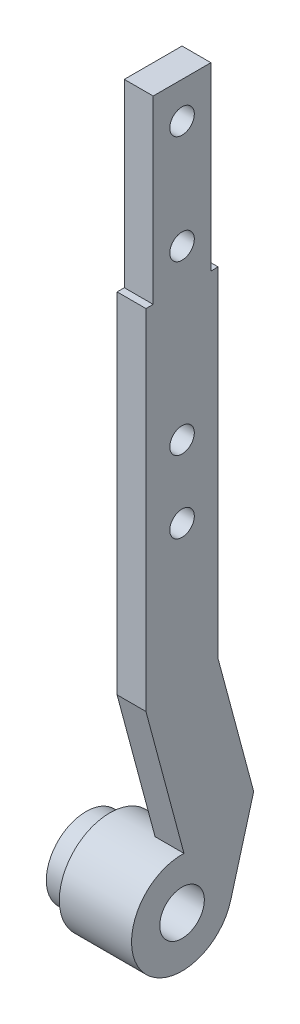
ISO-10303-21;
HEADER;
FILE_DESCRIPTION(('STEP AP214'),'2;1');
FILE_NAME('part.step','',(''),(''),'','','');
FILE_SCHEMA(('AUTOMOTIVE_DESIGN { 1 0 10303 214 1 1 1 1 }'));
ENDSEC;
DATA;
#1=APPLICATION_CONTEXT('core data for automotive mechanical design processes');
#2=APPLICATION_PROTOCOL_DEFINITION('international standard','automotive_design',2000,#1);
#3=PRODUCT_CONTEXT('',#1,'mechanical');
#4=PRODUCT('Part','Part','',(#3));
#5=PRODUCT_RELATED_PRODUCT_CATEGORY('part','',(#4));
#6=PRODUCT_DEFINITION_FORMATION('','',#4);
#7=PRODUCT_DEFINITION_CONTEXT('part definition',#1,'design');
#8=PRODUCT_DEFINITION('design','',#6,#7);
#9=PRODUCT_DEFINITION_SHAPE('','',#8);
#10=(LENGTH_UNIT() NAMED_UNIT(*) SI_UNIT(.MILLI.,.METRE.));
#11=(NAMED_UNIT(*) PLANE_ANGLE_UNIT() SI_UNIT($,.RADIAN.));
#12=(NAMED_UNIT(*) SI_UNIT($,.STERADIAN.) SOLID_ANGLE_UNIT());
#13=UNCERTAINTY_MEASURE_WITH_UNIT(LENGTH_MEASURE(1.E-05),#10,'distance_accuracy_value','');
#14=(GEOMETRIC_REPRESENTATION_CONTEXT(3) GLOBAL_UNCERTAINTY_ASSIGNED_CONTEXT((#13)) GLOBAL_UNIT_ASSIGNED_CONTEXT((#10,
#11,#12)) REPRESENTATION_CONTEXT('',''));
#15=CARTESIAN_POINT('',(0.,0.,0.));
#16=DIRECTION('',(0.,0.,1.));
#17=DIRECTION('',(1.,0.,0.));
#18=AXIS2_PLACEMENT_3D('',#15,#16,#17);
#19=CARTESIAN_POINT('',(-30.145,0.,0.));
#20=DIRECTION('',(1.,0.,0.));
#21=DIRECTION('',(0.,0.,-1.));
#22=AXIS2_PLACEMENT_3D('',#19,#20,#21);
#23=CYLINDRICAL_SURFACE('',#22,7.);
#24=CARTESIAN_POINT('',(-30.145,0.,0.));
#25=DIRECTION('',(-1.,0.,0.));
#26=DIRECTION('',(0.,0.,1.));
#27=AXIS2_PLACEMENT_3D('',#24,#25,#26);
#28=CIRCLE('',#27,7.);
#29=CARTESIAN_POINT('',(-30.145,0.,7.));
#30=VERTEX_POINT('',#29);
#31=EDGE_CURVE('E51',#30,#30,#28,.T.);
#32=ORIENTED_EDGE('',*,*,#31,.F.);
#33=EDGE_LOOP('',(#32));
#34=FACE_BOUND('',#33,.T.);
#35=DIRECTION('',(1.,0.,0.));
#36=VECTOR('',#35,1.);
#37=CARTESIAN_POINT('',(-24.145,6.99491771434268,-0.266694899791794));
#38=LINE('',#37,#36);
#39=CARTESIAN_POINT('',(-24.145,6.99491771434268,-0.266694899791794));
#40=VERTEX_POINT('',#39);
#41=CARTESIAN_POINT('',(-20.145,6.99491771434268,-0.266694899791793));
#42=VERTEX_POINT('',#41);
#43=EDGE_CURVE('E63',#40,#42,#38,.T.);
#44=ORIENTED_EDGE('',*,*,#43,.F.);
#45=CARTESIAN_POINT('',(-24.145,0.,0.));
#46=DIRECTION('',(-1.,0.,0.));
#47=DIRECTION('',(0.,0.,1.));
#48=AXIS2_PLACEMENT_3D('',#45,#46,#47);
#49=CIRCLE('',#48,7.);
#50=CARTESIAN_POINT('',(-24.145,-1.87292477240286,-6.74478708314204));
#51=VERTEX_POINT('',#50);
#52=EDGE_CURVE('E58',#40,#51,#49,.T.);
#53=ORIENTED_EDGE('',*,*,#52,.T.);
#54=DIRECTION('',(1.,0.,0.));
#55=VECTOR('',#54,1.);
#56=CARTESIAN_POINT('',(-24.145,-1.87292477240286,-6.74478708314204));
#57=LINE('',#56,#55);
#58=CARTESIAN_POINT('',(-20.145,-1.87292477240286,-6.74478708314204));
#59=VERTEX_POINT('',#58);
#60=EDGE_CURVE('E174',#51,#59,#57,.T.);
#61=ORIENTED_EDGE('',*,*,#60,.T.);
#62=CARTESIAN_POINT('',(-20.145,0.,0.));
#63=DIRECTION('',(-1.,0.,0.));
#64=DIRECTION('',(0.,0.,1.));
#65=AXIS2_PLACEMENT_3D('',#62,#63,#64);
#66=CIRCLE('',#65,7.);
#67=EDGE_CURVE('E233',#59,#42,#66,.T.);
#68=ORIENTED_EDGE('',*,*,#67,.T.);
#69=EDGE_LOOP('',(#44,#53,#61,#68));
#70=FACE_BOUND('',#69,.T.);
#71=ADVANCED_FACE('F43',(#34,#70),#23,.T.);
#72=CARTESIAN_POINT('',(-30.145,0.,0.));
#73=DIRECTION('',(1.,0.,0.));
#74=DIRECTION('',(0.,0.,-1.));
#75=AXIS2_PLACEMENT_3D('',#72,#73,#74);
#76=CYLINDRICAL_SURFACE('',#75,3.0845);
#77=CARTESIAN_POINT('',(-20.145,0.,0.));
#78=DIRECTION('',(-1.,0.,0.));
#79=DIRECTION('',(0.,0.,1.));
#80=AXIS2_PLACEMENT_3D('',#77,#78,#79);
#81=CIRCLE('',#80,3.0845);
#82=CARTESIAN_POINT('',(-20.145,0.,3.0845));
#83=VERTEX_POINT('',#82);
#84=EDGE_CURVE('E230',#83,#83,#81,.T.);
#85=ORIENTED_EDGE('',*,*,#84,.F.);
#86=EDGE_LOOP('',(#85));
#87=FACE_BOUND('',#86,.T.);
#88=CARTESIAN_POINT('',(-27.145,0.,0.));
#89=DIRECTION('',(-1.,0.,0.));
#90=DIRECTION('',(0.,0.,1.));
#91=AXIS2_PLACEMENT_3D('',#88,#89,#90);
#92=CIRCLE('',#91,3.0845);
#93=CARTESIAN_POINT('',(-27.145,0.,3.0845));
#94=VERTEX_POINT('',#93);
#95=EDGE_CURVE('E227',#94,#94,#92,.T.);
#96=ORIENTED_EDGE('',*,*,#95,.T.);
#97=EDGE_LOOP('',(#96));
#98=FACE_BOUND('',#97,.T.);
#99=ADVANCED_FACE('F45',(#87,#98),#76,.F.);
#100=CARTESIAN_POINT('',(-30.145,0.,0.));
#101=DIRECTION('',(-1.,0.,0.));
#102=DIRECTION('',(0.,0.,1.));
#103=AXIS2_PLACEMENT_3D('',#100,#101,#102);
#104=PLANE('',#103);
#105=CARTESIAN_POINT('',(-30.145,0.,0.));
#106=DIRECTION('',(-1.,0.,0.));
#107=DIRECTION('',(0.,0.,1.));
#108=AXIS2_PLACEMENT_3D('',#105,#106,#107);
#109=CIRCLE('',#108,5.49999999999996);
#110=CARTESIAN_POINT('',(-30.145,0.,5.49999999999996));
#111=VERTEX_POINT('',#110);
#112=EDGE_CURVE('E552',#111,#111,#109,.T.);
#113=ORIENTED_EDGE('',*,*,#112,.F.);
#114=EDGE_LOOP('',(#113));
#115=FACE_BOUND('',#114,.T.);
#116=ORIENTED_EDGE('',*,*,#31,.T.);
#117=EDGE_LOOP('',(#116));
#118=FACE_BOUND('',#117,.T.);
#119=ADVANCED_FACE('F293',(#115,#118),#104,.T.);
#120=CARTESIAN_POINT('',(-20.145,0.,0.));
#121=DIRECTION('',(-1.,0.,0.));
#122=DIRECTION('',(0.,0.,1.));
#123=AXIS2_PLACEMENT_3D('',#120,#121,#122);
#124=PLANE('',#123);
#125=CARTESIAN_POINT('',(-20.145,56.7479660865774,0.));
#126=DIRECTION('',(1.,0.,0.));
#127=DIRECTION('',(0.,0.,-1.));
#128=AXIS2_PLACEMENT_3D('',#125,#126,#127);
#129=CIRCLE('',#128,1.7);
#130=CARTESIAN_POINT('',(-20.145,56.7479660865774,-1.7));
#131=VERTEX_POINT('',#130);
#132=EDGE_CURVE('E548',#131,#131,#129,.T.);
#133=ORIENTED_EDGE('',*,*,#132,.F.);
#134=EDGE_LOOP('',(#133));
#135=FACE_BOUND('',#134,.T.);
#136=CARTESIAN_POINT('',(-20.145,46.7479660865774,0.));
#137=DIRECTION('',(1.,0.,0.));
#138=DIRECTION('',(0.,0.,-1.));
#139=AXIS2_PLACEMENT_3D('',#136,#137,#138);
#140=CIRCLE('',#139,1.7);
#141=CARTESIAN_POINT('',(-20.145,46.7479660865774,-1.7));
#142=VERTEX_POINT('',#141);
#143=EDGE_CURVE('E558',#142,#142,#140,.T.);
#144=ORIENTED_EDGE('',*,*,#143,.F.);
#145=EDGE_LOOP('',(#144));
#146=FACE_BOUND('',#145,.T.);
#147=ORIENTED_EDGE('',*,*,#84,.T.);
#148=EDGE_LOOP('',(#147));
#149=FACE_BOUND('',#148,.T.);
#150=ORIENTED_EDGE('',*,*,#67,.F.);
#151=DIRECTION('',(0.,-0.963541011877434,0.267560681771837));
#152=VECTOR('',#151,1.);
#153=CARTESIAN_POINT('',(-20.145,-1.87292477240286,-6.74478708314204));
#154=LINE('',#153,#152);
#155=CARTESIAN_POINT('',(-20.145,9.5831081653679,-9.92595316268247));
#156=VERTEX_POINT('',#155);
#157=EDGE_CURVE('E197',#156,#59,#154,.T.);
#158=ORIENTED_EDGE('',*,*,#157,.F.);
#159=DIRECTION('',(0.,-0.965925826289068,-0.258819045102521));
#160=VECTOR('',#159,1.);
#161=CARTESIAN_POINT('',(-20.145,3.12343481414323,-11.656817420512));
#162=LINE('',#161,#160);
#163=CARTESIAN_POINT('',(-20.145,27.9670156442034,-5.));
#164=VERTEX_POINT('',#163);
#165=EDGE_CURVE('E195',#164,#156,#162,.T.);
#166=ORIENTED_EDGE('',*,*,#165,.F.);
#167=DIRECTION('',(0.,-1.,0.));
#168=VECTOR('',#167,1.);
#169=CARTESIAN_POINT('',(-20.145,0.,-5.));
#170=LINE('',#169,#168);
#171=CARTESIAN_POINT('',(-20.145,75.,-5.));
#172=VERTEX_POINT('',#171);
#173=EDGE_CURVE('E192',#172,#164,#170,.T.);
#174=ORIENTED_EDGE('',*,*,#173,.F.);
#175=DIRECTION('',(0.,0.,1.));
#176=VECTOR('',#175,1.);
#177=CARTESIAN_POINT('',(-20.145,75.,0.));
#178=LINE('',#177,#176);
#179=CARTESIAN_POINT('',(-20.145,75.,-4.00000000000001));
#180=VERTEX_POINT('',#179);
#181=EDGE_CURVE('E189',#172,#180,#178,.T.);
#182=ORIENTED_EDGE('',*,*,#181,.T.);
#183=DIRECTION('',(0.,1.,0.));
#184=VECTOR('',#183,1.);
#185=CARTESIAN_POINT('',(-20.145,0.,-4.00000000000001));
#186=LINE('',#185,#184);
#187=CARTESIAN_POINT('',(-20.145,100.,-4.00000000000001));
#188=VERTEX_POINT('',#187);
#189=EDGE_CURVE('E186',#180,#188,#186,.T.);
#190=ORIENTED_EDGE('',*,*,#189,.T.);
#191=DIRECTION('',(0.,0.,-1.));
#192=VECTOR('',#191,1.);
#193=CARTESIAN_POINT('',(-20.145,100.,0.));
#194=LINE('',#193,#192);
#195=CARTESIAN_POINT('',(-20.145,100.,4.));
#196=VERTEX_POINT('',#195);
#197=EDGE_CURVE('E183',#196,#188,#194,.T.);
#198=ORIENTED_EDGE('',*,*,#197,.F.);
#199=DIRECTION('',(0.,1.,0.));
#200=VECTOR('',#199,1.);
#201=CARTESIAN_POINT('',(-20.145,0.,4.));
#202=LINE('',#201,#200);
#203=CARTESIAN_POINT('',(-20.145,75.,4.));
#204=VERTEX_POINT('',#203);
#205=EDGE_CURVE('E181',#204,#196,#202,.T.);
#206=ORIENTED_EDGE('',*,*,#205,.F.);
#207=DIRECTION('',(0.,0.,-1.));
#208=VECTOR('',#207,1.);
#209=CARTESIAN_POINT('',(-20.145,75.,0.));
#210=LINE('',#209,#208);
#211=CARTESIAN_POINT('',(-20.145,75.,4.99999999999999));
#212=VERTEX_POINT('',#211);
#213=EDGE_CURVE('E179',#212,#204,#210,.T.);
#214=ORIENTED_EDGE('',*,*,#213,.F.);
#215=DIRECTION('',(0.,1.,0.));
#216=VECTOR('',#215,1.);
#217=CARTESIAN_POINT('',(-20.145,0.,4.99999999999999));
#218=LINE('',#217,#216);
#219=CARTESIAN_POINT('',(-20.145,26.6504906683294,4.99999999999999));
#220=VERTEX_POINT('',#219);
#221=EDGE_CURVE('E176',#220,#212,#218,.T.);
#222=ORIENTED_EDGE('',*,*,#221,.F.);
#223=DIRECTION('',(0.,0.965925826289068,0.258819045102521));
#224=VECTOR('',#223,1.);
#225=CARTESIAN_POINT('',(-20.145,0.53524436311802,-1.99755915762129));
#226=LINE('',#225,#224);
#227=EDGE_CURVE('E137',#42,#220,#226,.T.);
#228=ORIENTED_EDGE('',*,*,#227,.F.);
#229=EDGE_LOOP('',(#150,#158,#166,#174,#182,#190,#198,#206,#214,#222,#228));
#230=FACE_BOUND('',#229,.T.);
#231=CARTESIAN_POINT('',(-20.145,80.,0.));
#232=DIRECTION('',(-1.,0.,0.));
#233=DIRECTION('',(0.,0.,1.));
#234=AXIS2_PLACEMENT_3D('',#231,#232,#233);
#235=CIRCLE('',#234,1.70000000000001);
#236=CARTESIAN_POINT('',(-20.145,80.,1.7));
#237=VERTEX_POINT('',#236);
#238=EDGE_CURVE('E200',#237,#237,#235,.T.);
#239=ORIENTED_EDGE('',*,*,#238,.T.);
#240=EDGE_LOOP('',(#239));
#241=FACE_BOUND('',#240,.T.);
#242=CARTESIAN_POINT('',(-20.145,95.,0.));
#243=DIRECTION('',(-1.,0.,0.));
#244=DIRECTION('',(0.,0.,1.));
#245=AXIS2_PLACEMENT_3D('',#242,#243,#244);
#246=CIRCLE('',#245,1.70000000000001);
#247=CARTESIAN_POINT('',(-20.145,95.,1.7));
#248=VERTEX_POINT('',#247);
#249=EDGE_CURVE('E203',#248,#248,#246,.T.);
#250=ORIENTED_EDGE('',*,*,#249,.T.);
#251=EDGE_LOOP('',(#250));
#252=FACE_BOUND('',#251,.T.);
#253=ADVANCED_FACE('F238',(#135,#146,#149,#230,#241,#252),#124,.F.);
#254=CARTESIAN_POINT('',(-27.145,0.,0.));
#255=DIRECTION('',(-1.,0.,0.));
#256=DIRECTION('',(0.,0.,1.));
#257=AXIS2_PLACEMENT_3D('',#254,#255,#256);
#258=PLANE('',#257);
#259=ORIENTED_EDGE('',*,*,#95,.F.);
#260=EDGE_LOOP('',(#259));
#261=FACE_BOUND('',#260,.T.);
#262=ADVANCED_FACE('F299',(#261),#258,.F.);
#263=CARTESIAN_POINT('',(-24.145,0.53524436311802,-1.99755915762129));
#264=DIRECTION('',(0.,0.258819045102521,-0.965925826289068));
#265=DIRECTION('',(0.,0.965925826289068,0.258819045102521));
#266=AXIS2_PLACEMENT_3D('',#263,#264,#265);
#267=PLANE('',#266);
#268=ORIENTED_EDGE('',*,*,#227,.T.);
#269=DIRECTION('',(1.,0.,0.));
#270=VECTOR('',#269,1.);
#271=CARTESIAN_POINT('',(-24.145,26.6504906683294,4.99999999999999));
#272=LINE('',#271,#270);
#273=CARTESIAN_POINT('',(-24.145,26.6504906683294,4.99999999999999));
#274=VERTEX_POINT('',#273);
#275=EDGE_CURVE('E134',#274,#220,#272,.T.);
#276=ORIENTED_EDGE('',*,*,#275,.F.);
#277=DIRECTION('',(0.,0.965925826289068,0.258819045102521));
#278=VECTOR('',#277,1.);
#279=CARTESIAN_POINT('',(-24.145,0.53524436311802,-1.99755915762129));
#280=LINE('',#279,#278);
#281=EDGE_CURVE('E124',#40,#274,#280,.T.);
#282=ORIENTED_EDGE('',*,*,#281,.F.);
#283=ORIENTED_EDGE('',*,*,#43,.T.);
#284=EDGE_LOOP('',(#268,#276,#282,#283));
#285=FACE_BOUND('',#284,.T.);
#286=ADVANCED_FACE('F135',(#285),#267,.F.);
#287=CARTESIAN_POINT('',(-24.145,0.,4.99999999999999));
#288=DIRECTION('',(0.,0.,-1.));
#289=DIRECTION('',(-1.,0.,0.));
#290=AXIS2_PLACEMENT_3D('',#287,#288,#289);
#291=PLANE('',#290);
#292=ORIENTED_EDGE('',*,*,#221,.T.);
#293=DIRECTION('',(1.,0.,0.));
#294=VECTOR('',#293,1.);
#295=CARTESIAN_POINT('',(-24.145,75.,4.99999999999999));
#296=LINE('',#295,#294);
#297=CARTESIAN_POINT('',(-24.145,75.,4.99999999999999));
#298=VERTEX_POINT('',#297);
#299=EDGE_CURVE('E140',#298,#212,#296,.T.);
#300=ORIENTED_EDGE('',*,*,#299,.F.);
#301=DIRECTION('',(0.,1.,0.));
#302=VECTOR('',#301,1.);
#303=CARTESIAN_POINT('',(-24.145,0.,4.99999999999999));
#304=LINE('',#303,#302);
#305=EDGE_CURVE('E129',#274,#298,#304,.T.);
#306=ORIENTED_EDGE('',*,*,#305,.F.);
#307=ORIENTED_EDGE('',*,*,#275,.T.);
#308=EDGE_LOOP('',(#292,#300,#306,#307));
#309=FACE_BOUND('',#308,.T.);
#310=ADVANCED_FACE('F142',(#309),#291,.F.);
#311=CARTESIAN_POINT('',(-24.145,75.,0.));
#312=DIRECTION('',(0.,-1.,0.));
#313=DIRECTION('',(1.,0.,0.));
#314=AXIS2_PLACEMENT_3D('',#311,#312,#313);
#315=PLANE('',#314);
#316=ORIENTED_EDGE('',*,*,#213,.T.);
#317=DIRECTION('',(1.,0.,0.));
#318=VECTOR('',#317,1.);
#319=CARTESIAN_POINT('',(-24.145,75.,4.));
#320=LINE('',#319,#318);
#321=CARTESIAN_POINT('',(-24.145,75.,4.));
#322=VERTEX_POINT('',#321);
#323=EDGE_CURVE('E222',#322,#204,#320,.T.);
#324=ORIENTED_EDGE('',*,*,#323,.F.);
#325=DIRECTION('',(0.,0.,-1.));
#326=VECTOR('',#325,1.);
#327=CARTESIAN_POINT('',(-24.145,75.,0.));
#328=LINE('',#327,#326);
#329=EDGE_CURVE('E146',#298,#322,#328,.T.);
#330=ORIENTED_EDGE('',*,*,#329,.F.);
#331=ORIENTED_EDGE('',*,*,#299,.T.);
#332=EDGE_LOOP('',(#316,#324,#330,#331));
#333=FACE_BOUND('',#332,.T.);
#334=ADVANCED_FACE('F243',(#333),#315,.F.);
#335=CARTESIAN_POINT('',(-24.145,0.,4.));
#336=DIRECTION('',(0.,0.,-1.));
#337=DIRECTION('',(-1.,0.,0.));
#338=AXIS2_PLACEMENT_3D('',#335,#336,#337);
#339=PLANE('',#338);
#340=ORIENTED_EDGE('',*,*,#205,.T.);
#341=DIRECTION('',(1.,0.,0.));
#342=VECTOR('',#341,1.);
#343=CARTESIAN_POINT('',(-24.145,100.,4.));
#344=LINE('',#343,#342);
#345=CARTESIAN_POINT('',(-24.145,100.,4.));
#346=VERTEX_POINT('',#345);
#347=EDGE_CURVE('E219',#346,#196,#344,.T.);
#348=ORIENTED_EDGE('',*,*,#347,.F.);
#349=DIRECTION('',(0.,1.,0.));
#350=VECTOR('',#349,1.);
#351=CARTESIAN_POINT('',(-24.145,0.,4.));
#352=LINE('',#351,#350);
#353=EDGE_CURVE('E149',#322,#346,#352,.T.);
#354=ORIENTED_EDGE('',*,*,#353,.F.);
#355=ORIENTED_EDGE('',*,*,#323,.T.);
#356=EDGE_LOOP('',(#340,#348,#354,#355));
#357=FACE_BOUND('',#356,.T.);
#358=ADVANCED_FACE('F251',(#357),#339,.F.);
#359=CARTESIAN_POINT('',(-24.145,100.,0.));
#360=DIRECTION('',(0.,-1.,0.));
#361=DIRECTION('',(1.,0.,0.));
#362=AXIS2_PLACEMENT_3D('',#359,#360,#361);
#363=PLANE('',#362);
#364=ORIENTED_EDGE('',*,*,#197,.T.);
#365=DIRECTION('',(1.,0.,0.));
#366=VECTOR('',#365,1.);
#367=CARTESIAN_POINT('',(-24.145,100.,-4.00000000000001));
#368=LINE('',#367,#366);
#369=CARTESIAN_POINT('',(-24.145,100.,-4.00000000000001));
#370=VERTEX_POINT('',#369);
#371=EDGE_CURVE('E217',#370,#188,#368,.T.);
#372=ORIENTED_EDGE('',*,*,#371,.F.);
#373=DIRECTION('',(0.,0.,-1.));
#374=VECTOR('',#373,1.);
#375=CARTESIAN_POINT('',(-24.145,100.,0.));
#376=LINE('',#375,#374);
#377=EDGE_CURVE('E154',#346,#370,#376,.T.);
#378=ORIENTED_EDGE('',*,*,#377,.F.);
#379=ORIENTED_EDGE('',*,*,#347,.T.);
#380=EDGE_LOOP('',(#364,#372,#378,#379));
#381=FACE_BOUND('',#380,.T.);
#382=ADVANCED_FACE('F254',(#381),#363,.F.);
#383=CARTESIAN_POINT('',(-24.145,0.,-4.00000000000001));
#384=DIRECTION('',(0.,0.,-1.));
#385=DIRECTION('',(-1.,0.,0.));
#386=AXIS2_PLACEMENT_3D('',#383,#384,#385);
#387=PLANE('',#386);
#388=ORIENTED_EDGE('',*,*,#189,.F.);
#389=DIRECTION('',(1.,0.,0.));
#390=VECTOR('',#389,1.);
#391=CARTESIAN_POINT('',(-24.145,75.,-4.00000000000001));
#392=LINE('',#391,#390);
#393=CARTESIAN_POINT('',(-24.145,75.,-4.00000000000001));
#394=VERTEX_POINT('',#393);
#395=EDGE_CURVE('E215',#394,#180,#392,.T.);
#396=ORIENTED_EDGE('',*,*,#395,.F.);
#397=DIRECTION('',(0.,1.,0.));
#398=VECTOR('',#397,1.);
#399=CARTESIAN_POINT('',(-24.145,0.,-4.00000000000001));
#400=LINE('',#399,#398);
#401=EDGE_CURVE('E156',#394,#370,#400,.T.);
#402=ORIENTED_EDGE('',*,*,#401,.T.);
#403=ORIENTED_EDGE('',*,*,#371,.T.);
#404=EDGE_LOOP('',(#388,#396,#402,#403));
#405=FACE_BOUND('',#404,.T.);
#406=ADVANCED_FACE('F257',(#405),#387,.T.);
#407=CARTESIAN_POINT('',(-24.145,75.,0.));
#408=DIRECTION('',(0.,1.,0.));
#409=DIRECTION('',(-1.,0.,0.));
#410=AXIS2_PLACEMENT_3D('',#407,#408,#409);
#411=PLANE('',#410);
#412=ORIENTED_EDGE('',*,*,#181,.F.);
#413=DIRECTION('',(1.,0.,0.));
#414=VECTOR('',#413,1.);
#415=CARTESIAN_POINT('',(-24.145,75.,-5.));
#416=LINE('',#415,#414);
#417=CARTESIAN_POINT('',(-24.145,75.,-5.));
#418=VERTEX_POINT('',#417);
#419=EDGE_CURVE('E213',#418,#172,#416,.T.);
#420=ORIENTED_EDGE('',*,*,#419,.F.);
#421=DIRECTION('',(0.,0.,1.));
#422=VECTOR('',#421,1.);
#423=CARTESIAN_POINT('',(-24.145,75.,0.));
#424=LINE('',#423,#422);
#425=EDGE_CURVE('E159',#418,#394,#424,.T.);
#426=ORIENTED_EDGE('',*,*,#425,.T.);
#427=ORIENTED_EDGE('',*,*,#395,.T.);
#428=EDGE_LOOP('',(#412,#420,#426,#427));
#429=FACE_BOUND('',#428,.T.);
#430=ADVANCED_FACE('F261',(#429),#411,.T.);
#431=CARTESIAN_POINT('',(-24.145,0.,-5.));
#432=DIRECTION('',(0.,0.,1.));
#433=DIRECTION('',(1.,0.,0.));
#434=AXIS2_PLACEMENT_3D('',#431,#432,#433);
#435=PLANE('',#434);
#436=ORIENTED_EDGE('',*,*,#173,.T.);
#437=DIRECTION('',(1.,0.,0.));
#438=VECTOR('',#437,1.);
#439=CARTESIAN_POINT('',(-24.145,27.9670156442034,-5.));
#440=LINE('',#439,#438);
#441=CARTESIAN_POINT('',(-24.145,27.9670156442034,-5.));
#442=VERTEX_POINT('',#441);
#443=EDGE_CURVE('E210',#442,#164,#440,.T.);
#444=ORIENTED_EDGE('',*,*,#443,.F.);
#445=DIRECTION('',(0.,-1.,0.));
#446=VECTOR('',#445,1.);
#447=CARTESIAN_POINT('',(-24.145,0.,-5.));
#448=LINE('',#447,#446);
#449=EDGE_CURVE('E162',#418,#442,#448,.T.);
#450=ORIENTED_EDGE('',*,*,#449,.F.);
#451=ORIENTED_EDGE('',*,*,#419,.T.);
#452=EDGE_LOOP('',(#436,#444,#450,#451));
#453=FACE_BOUND('',#452,.T.);
#454=ADVANCED_FACE('F266',(#453),#435,.F.);
#455=CARTESIAN_POINT('',(-24.145,3.12343481414323,-11.656817420512));
#456=DIRECTION('',(0.,-0.258819045102521,0.965925826289068));
#457=DIRECTION('',(0.,-0.965925826289068,-0.258819045102521));
#458=AXIS2_PLACEMENT_3D('',#455,#456,#457);
#459=PLANE('',#458);
#460=ORIENTED_EDGE('',*,*,#165,.T.);
#461=DIRECTION('',(1.,0.,0.));
#462=VECTOR('',#461,1.);
#463=CARTESIAN_POINT('',(-24.145,9.5831081653679,-9.92595316268247));
#464=LINE('',#463,#462);
#465=CARTESIAN_POINT('',(-24.145,9.5831081653679,-9.92595316268247));
#466=VERTEX_POINT('',#465);
#467=EDGE_CURVE('E207',#466,#156,#464,.T.);
#468=ORIENTED_EDGE('',*,*,#467,.F.);
#469=DIRECTION('',(0.,-0.965925826289068,-0.258819045102521));
#470=VECTOR('',#469,1.);
#471=CARTESIAN_POINT('',(-24.145,3.12343481414323,-11.656817420512));
#472=LINE('',#471,#470);
#473=EDGE_CURVE('E164',#442,#466,#472,.T.);
#474=ORIENTED_EDGE('',*,*,#473,.F.);
#475=ORIENTED_EDGE('',*,*,#443,.T.);
#476=EDGE_LOOP('',(#460,#468,#474,#475));
#477=FACE_BOUND('',#476,.T.);
#478=ADVANCED_FACE('F271',(#477),#459,.F.);
#479=CARTESIAN_POINT('',(-24.145,80.,0.));
#480=DIRECTION('',(1.,0.,0.));
#481=DIRECTION('',(0.,0.,-1.));
#482=AXIS2_PLACEMENT_3D('',#479,#480,#481);
#483=CYLINDRICAL_SURFACE('',#482,1.70000000000001);
#484=CARTESIAN_POINT('',(-24.145,80.,0.));
#485=DIRECTION('',(-1.,0.,0.));
#486=DIRECTION('',(0.,0.,1.));
#487=AXIS2_PLACEMENT_3D('',#484,#485,#486);
#488=CIRCLE('',#487,1.70000000000001);
#489=CARTESIAN_POINT('',(-24.145,80.,1.7));
#490=VERTEX_POINT('',#489);
#491=EDGE_CURVE('E168',#490,#490,#488,.T.);
#492=ORIENTED_EDGE('',*,*,#491,.T.);
#493=EDGE_LOOP('',(#492));
#494=FACE_BOUND('',#493,.T.);
#495=ORIENTED_EDGE('',*,*,#238,.F.);
#496=EDGE_LOOP('',(#495));
#497=FACE_BOUND('',#496,.T.);
#498=ADVANCED_FACE('F277',(#494,#497),#483,.F.);
#499=CARTESIAN_POINT('',(-24.145,-1.87292477240286,-6.74478708314204));
#500=DIRECTION('',(0.,0.267560681771837,0.963541011877434));
#501=DIRECTION('',(0.,-0.963541011877434,0.267560681771837));
#502=AXIS2_PLACEMENT_3D('',#499,#500,#501);
#503=PLANE('',#502);
#504=ORIENTED_EDGE('',*,*,#157,.T.);
#505=ORIENTED_EDGE('',*,*,#60,.F.);
#506=DIRECTION('',(0.,-0.963541011877434,0.267560681771837));
#507=VECTOR('',#506,1.);
#508=CARTESIAN_POINT('',(-24.145,-1.87292477240286,-6.74478708314204));
#509=LINE('',#508,#507);
#510=EDGE_CURVE('E166',#466,#51,#509,.T.);
#511=ORIENTED_EDGE('',*,*,#510,.F.);
#512=ORIENTED_EDGE('',*,*,#467,.T.);
#513=EDGE_LOOP('',(#504,#505,#511,#512));
#514=FACE_BOUND('',#513,.T.);
#515=ADVANCED_FACE('F274',(#514),#503,.F.);
#516=CARTESIAN_POINT('',(-24.145,95.,0.));
#517=DIRECTION('',(1.,0.,0.));
#518=DIRECTION('',(0.,0.,-1.));
#519=AXIS2_PLACEMENT_3D('',#516,#517,#518);
#520=CYLINDRICAL_SURFACE('',#519,1.70000000000001);
#521=CARTESIAN_POINT('',(-24.145,95.,0.));
#522=DIRECTION('',(-1.,0.,0.));
#523=DIRECTION('',(0.,0.,1.));
#524=AXIS2_PLACEMENT_3D('',#521,#522,#523);
#525=CIRCLE('',#524,1.70000000000001);
#526=CARTESIAN_POINT('',(-24.145,95.,1.7));
#527=VERTEX_POINT('',#526);
#528=EDGE_CURVE('E171',#527,#527,#525,.T.);
#529=ORIENTED_EDGE('',*,*,#528,.T.);
#530=EDGE_LOOP('',(#529));
#531=FACE_BOUND('',#530,.T.);
#532=ORIENTED_EDGE('',*,*,#249,.F.);
#533=EDGE_LOOP('',(#532));
#534=FACE_BOUND('',#533,.T.);
#535=ADVANCED_FACE('F276',(#531,#534),#520,.F.);
#536=CARTESIAN_POINT('',(-24.145,0.,0.));
#537=DIRECTION('',(-1.,0.,0.));
#538=DIRECTION('',(0.,0.,1.));
#539=AXIS2_PLACEMENT_3D('',#536,#537,#538);
#540=PLANE('',#539);
#541=CARTESIAN_POINT('',(-24.145,56.7479660865774,0.));
#542=DIRECTION('',(-1.,0.,0.));
#543=DIRECTION('',(0.,0.,1.));
#544=AXIS2_PLACEMENT_3D('',#541,#542,#543);
#545=CIRCLE('',#544,1.7);
#546=CARTESIAN_POINT('',(-24.145,56.7479660865774,1.7));
#547=VERTEX_POINT('',#546);
#548=EDGE_CURVE('E551',#547,#547,#545,.F.);
#549=ORIENTED_EDGE('',*,*,#548,.T.);
#550=EDGE_LOOP('',(#549));
#551=FACE_BOUND('',#550,.T.);
#552=CARTESIAN_POINT('',(-24.145,46.7479660865774,0.));
#553=DIRECTION('',(-1.,0.,0.));
#554=DIRECTION('',(0.,0.,1.));
#555=AXIS2_PLACEMENT_3D('',#552,#553,#554);
#556=CIRCLE('',#555,1.7);
#557=CARTESIAN_POINT('',(-24.145,46.7479660865774,1.69999999999999));
#558=VERTEX_POINT('',#557);
#559=EDGE_CURVE('E561',#558,#558,#556,.F.);
#560=ORIENTED_EDGE('',*,*,#559,.T.);
#561=EDGE_LOOP('',(#560));
#562=FACE_BOUND('',#561,.T.);
#563=ORIENTED_EDGE('',*,*,#52,.F.);
#564=ORIENTED_EDGE('',*,*,#281,.T.);
#565=ORIENTED_EDGE('',*,*,#305,.T.);
#566=ORIENTED_EDGE('',*,*,#329,.T.);
#567=ORIENTED_EDGE('',*,*,#353,.T.);
#568=ORIENTED_EDGE('',*,*,#377,.T.);
#569=ORIENTED_EDGE('',*,*,#401,.F.);
#570=ORIENTED_EDGE('',*,*,#425,.F.);
#571=ORIENTED_EDGE('',*,*,#449,.T.);
#572=ORIENTED_EDGE('',*,*,#473,.T.);
#573=ORIENTED_EDGE('',*,*,#510,.T.);
#574=EDGE_LOOP('',(#563,#564,#565,#566,#567,#568,#569,#570,#571,#572,#573));
#575=FACE_BOUND('',#574,.T.);
#576=ORIENTED_EDGE('',*,*,#491,.F.);
#577=EDGE_LOOP('',(#576));
#578=FACE_BOUND('',#577,.T.);
#579=ORIENTED_EDGE('',*,*,#528,.F.);
#580=EDGE_LOOP('',(#579));
#581=FACE_BOUND('',#580,.T.);
#582=ADVANCED_FACE('F126',(#551,#562,#575,#578,#581),#540,.T.);
#583=CARTESIAN_POINT('',(-49.0063491861039,0.,0.));
#584=DIRECTION('',(1.,0.,0.));
#585=DIRECTION('',(0.,0.,-1.));
#586=AXIS2_PLACEMENT_3D('',#583,#584,#585);
#587=CYLINDRICAL_SURFACE('',#586,5.49999999999996);
#588=ORIENTED_EDGE('',*,*,#112,.T.);
#589=EDGE_LOOP('',(#588));
#590=FACE_BOUND('',#589,.T.);
#591=CARTESIAN_POINT('',(-33.45,0.,0.));
#592=DIRECTION('',(-1.,0.,0.));
#593=DIRECTION('',(0.,0.,1.));
#594=AXIS2_PLACEMENT_3D('',#591,#592,#593);
#595=CIRCLE('',#594,5.49999999999996);
#596=CARTESIAN_POINT('',(-33.45,0.,5.49999999999996));
#597=VERTEX_POINT('',#596);
#598=EDGE_CURVE('E177',#597,#597,#595,.T.);
#599=ORIENTED_EDGE('',*,*,#598,.F.);
#600=EDGE_LOOP('',(#599));
#601=FACE_BOUND('',#600,.T.);
#602=ADVANCED_FACE('F362',(#590,#601),#587,.T.);
#603=CARTESIAN_POINT('',(-49.0063491861039,0.,0.));
#604=DIRECTION('',(1.,0.,0.));
#605=DIRECTION('',(0.,0.,-1.));
#606=AXIS2_PLACEMENT_3D('',#603,#604,#605);
#607=CYLINDRICAL_SURFACE('',#606,3.49999999999996);
#608=CARTESIAN_POINT('',(-30.145,0.,0.));
#609=DIRECTION('',(-1.,0.,0.));
#610=DIRECTION('',(0.,0.,1.));
#611=AXIS2_PLACEMENT_3D('',#608,#609,#610);
#612=CIRCLE('',#611,3.49999999999996);
#613=CARTESIAN_POINT('',(-30.145,0.,3.49999999999996));
#614=VERTEX_POINT('',#613);
#615=EDGE_CURVE('E11',#614,#614,#612,.F.);
#616=ORIENTED_EDGE('',*,*,#615,.T.);
#617=EDGE_LOOP('',(#616));
#618=FACE_BOUND('',#617,.T.);
#619=CARTESIAN_POINT('',(-33.45,0.,0.));
#620=DIRECTION('',(-1.,0.,0.));
#621=DIRECTION('',(0.,0.,1.));
#622=AXIS2_PLACEMENT_3D('',#619,#620,#621);
#623=CIRCLE('',#622,3.49999999999996);
#624=CARTESIAN_POINT('',(-33.45,0.,3.49999999999996));
#625=VERTEX_POINT('',#624);
#626=EDGE_CURVE('E556',#625,#625,#623,.T.);
#627=ORIENTED_EDGE('',*,*,#626,.T.);
#628=EDGE_LOOP('',(#627));
#629=FACE_BOUND('',#628,.T.);
#630=ADVANCED_FACE('F367',(#618,#629),#607,.F.);
#631=CARTESIAN_POINT('',(-33.45,0.,0.));
#632=DIRECTION('',(-1.,0.,0.));
#633=DIRECTION('',(0.,0.965925826289068,0.258819045102521));
#634=AXIS2_PLACEMENT_3D('',#631,#632,#633);
#635=PLANE('',#634);
#636=ORIENTED_EDGE('',*,*,#626,.F.);
#637=EDGE_LOOP('',(#636));
#638=FACE_BOUND('',#637,.T.);
#639=ORIENTED_EDGE('',*,*,#598,.T.);
#640=EDGE_LOOP('',(#639));
#641=FACE_BOUND('',#640,.T.);
#642=ADVANCED_FACE('F379',(#638,#641),#635,.T.);
#643=ORIENTED_EDGE('',*,*,#615,.F.);
#644=EDGE_LOOP('',(#643));
#645=FACE_BOUND('',#644,.T.);
#646=ADVANCED_FACE('F304',(#645),#104,.T.);
#647=CARTESIAN_POINT('',(-28.9533261120685,46.7479660865774,0.));
#648=DIRECTION('',(1.,0.,0.));
#649=DIRECTION('',(0.,0.,-1.));
#650=AXIS2_PLACEMENT_3D('',#647,#648,#649);
#651=CYLINDRICAL_SURFACE('',#650,1.7);
#652=ORIENTED_EDGE('',*,*,#143,.T.);
#653=EDGE_LOOP('',(#652));
#654=FACE_BOUND('',#653,.T.);
#655=ORIENTED_EDGE('',*,*,#559,.F.);
#656=EDGE_LOOP('',(#655));
#657=FACE_BOUND('',#656,.T.);
#658=ADVANCED_FACE('F401',(#654,#657),#651,.F.);
#659=CARTESIAN_POINT('',(-28.9533261120685,56.7479660865774,0.));
#660=DIRECTION('',(1.,0.,0.));
#661=DIRECTION('',(0.,0.,-1.));
#662=AXIS2_PLACEMENT_3D('',#659,#660,#661);
#663=CYLINDRICAL_SURFACE('',#662,1.7);
#664=ORIENTED_EDGE('',*,*,#132,.T.);
#665=EDGE_LOOP('',(#664));
#666=FACE_BOUND('',#665,.T.);
#667=ORIENTED_EDGE('',*,*,#548,.F.);
#668=EDGE_LOOP('',(#667));
#669=FACE_BOUND('',#668,.T.);
#670=ADVANCED_FACE('F428',(#666,#669),#663,.F.);
#671=CLOSED_SHELL('',(#71,#99,#119,#253,#262,#286,#310,#334,#358,#382,#406,#430,#454,#478,#498,
#515,#535,#582,#602,#630,#642,#646,#658,#670));
#672=MANIFOLD_SOLID_BREP('B2',#671);
#673=ADVANCED_BREP_SHAPE_REPRESENTATION('',(#18,#672),#14);
#674=SHAPE_DEFINITION_REPRESENTATION(#9,#673);
ENDSEC;
END-ISO-10303-21;
